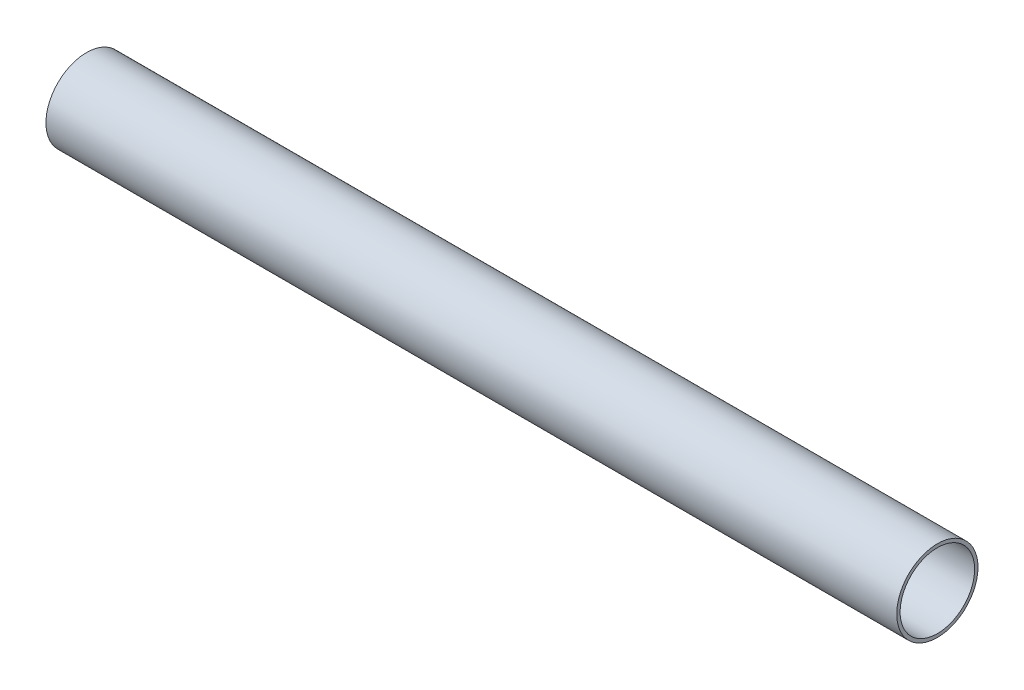
ISO-10303-21;
HEADER;
FILE_DESCRIPTION(('STEP AP214'),'2;1');
FILE_NAME('part.step','',(''),(''),'','','');
FILE_SCHEMA(('AUTOMOTIVE_DESIGN { 1 0 10303 214 1 1 1 1 }'));
ENDSEC;
DATA;
#1=APPLICATION_CONTEXT('core data for automotive mechanical design processes');
#2=APPLICATION_PROTOCOL_DEFINITION('international standard','automotive_design',2000,#1);
#3=PRODUCT_CONTEXT('',#1,'mechanical');
#4=PRODUCT('Part','Part','',(#3));
#5=PRODUCT_RELATED_PRODUCT_CATEGORY('part','',(#4));
#6=PRODUCT_DEFINITION_FORMATION('','',#4);
#7=PRODUCT_DEFINITION_CONTEXT('part definition',#1,'design');
#8=PRODUCT_DEFINITION('design','',#6,#7);
#9=PRODUCT_DEFINITION_SHAPE('','',#8);
#10=(LENGTH_UNIT() NAMED_UNIT(*) SI_UNIT(.MILLI.,.METRE.));
#11=(NAMED_UNIT(*) PLANE_ANGLE_UNIT() SI_UNIT($,.RADIAN.));
#12=(NAMED_UNIT(*) SI_UNIT($,.STERADIAN.) SOLID_ANGLE_UNIT());
#13=UNCERTAINTY_MEASURE_WITH_UNIT(LENGTH_MEASURE(1.E-05),#10,'distance_accuracy_value','');
#14=(GEOMETRIC_REPRESENTATION_CONTEXT(3) GLOBAL_UNCERTAINTY_ASSIGNED_CONTEXT((#13)) GLOBAL_UNIT_ASSIGNED_CONTEXT((#10,
#11,#12)) REPRESENTATION_CONTEXT('',''));
#15=CARTESIAN_POINT('',(0.,0.,0.));
#16=DIRECTION('',(0.,0.,1.));
#17=DIRECTION('',(1.,0.,0.));
#18=AXIS2_PLACEMENT_3D('',#15,#16,#17);
#19=CARTESIAN_POINT('',(398.8308,0.,0.));
#20=DIRECTION('',(1.,0.,0.));
#21=DIRECTION('',(0.,0.,-1.));
#22=AXIS2_PLACEMENT_3D('',#19,#20,#21);
#23=PLANE('',#22);
#24=CARTESIAN_POINT('',(398.8308,0.,0.));
#25=DIRECTION('',(1.,0.,0.));
#26=DIRECTION('',(0.,0.,-1.));
#27=AXIS2_PLACEMENT_3D('',#24,#25,#26);
#28=CIRCLE('',#27,19.05);
#29=CARTESIAN_POINT('',(398.8308,0.,-19.05));
#30=VERTEX_POINT('',#29);
#31=EDGE_CURVE('E10',#30,#30,#28,.T.);
#32=ORIENTED_EDGE('',*,*,#31,.T.);
#33=EDGE_LOOP('',(#32));
#34=FACE_BOUND('',#33,.T.);
#35=CARTESIAN_POINT('',(398.8308,0.,0.));
#36=DIRECTION('',(1.,0.,0.));
#37=DIRECTION('',(0.,0.,-1.));
#38=AXIS2_PLACEMENT_3D('',#35,#36,#37);
#39=CIRCLE('',#38,17.4625);
#40=CARTESIAN_POINT('',(398.8308,0.,-17.4625));
#41=VERTEX_POINT('',#40);
#42=EDGE_CURVE('E44',#41,#41,#39,.T.);
#43=ORIENTED_EDGE('',*,*,#42,.F.);
#44=EDGE_LOOP('',(#43));
#45=FACE_BOUND('',#44,.T.);
#46=ADVANCED_FACE('F33',(#34,#45),#23,.T.);
#47=CARTESIAN_POINT('',(0.,0.,0.));
#48=DIRECTION('',(1.,0.,0.));
#49=DIRECTION('',(0.,0.,-1.));
#50=AXIS2_PLACEMENT_3D('',#47,#48,#49);
#51=PLANE('',#50);
#52=CARTESIAN_POINT('',(0.,0.,0.));
#53=DIRECTION('',(1.,0.,0.));
#54=DIRECTION('',(0.,0.,-1.));
#55=AXIS2_PLACEMENT_3D('',#52,#53,#54);
#56=CIRCLE('',#55,19.05);
#57=CARTESIAN_POINT('',(0.,0.,-19.05));
#58=VERTEX_POINT('',#57);
#59=EDGE_CURVE('E37',#58,#58,#56,.T.);
#60=ORIENTED_EDGE('',*,*,#59,.F.);
#61=EDGE_LOOP('',(#60));
#62=FACE_BOUND('',#61,.T.);
#63=CARTESIAN_POINT('',(0.,0.,0.));
#64=DIRECTION('',(1.,0.,0.));
#65=DIRECTION('',(0.,0.,-1.));
#66=AXIS2_PLACEMENT_3D('',#63,#64,#65);
#67=CIRCLE('',#66,17.4625);
#68=CARTESIAN_POINT('',(0.,0.,-17.4625));
#69=VERTEX_POINT('',#68);
#70=EDGE_CURVE('E46',#69,#69,#67,.T.);
#71=ORIENTED_EDGE('',*,*,#70,.T.);
#72=EDGE_LOOP('',(#71));
#73=FACE_BOUND('',#72,.T.);
#74=ADVANCED_FACE('F56',(#62,#73),#51,.F.);
#75=CARTESIAN_POINT('',(398.8308,0.,0.));
#76=DIRECTION('',(-1.,0.,0.));
#77=DIRECTION('',(0.,0.,1.));
#78=AXIS2_PLACEMENT_3D('',#75,#76,#77);
#79=CYLINDRICAL_SURFACE('',#78,19.05);
#80=ORIENTED_EDGE('',*,*,#31,.F.);
#81=EDGE_LOOP('',(#80));
#82=FACE_BOUND('',#81,.T.);
#83=ORIENTED_EDGE('',*,*,#59,.T.);
#84=EDGE_LOOP('',(#83));
#85=FACE_BOUND('',#84,.T.);
#86=ADVANCED_FACE('F35',(#82,#85),#79,.T.);
#87=CARTESIAN_POINT('',(398.8308,0.,0.));
#88=DIRECTION('',(-1.,0.,0.));
#89=DIRECTION('',(0.,0.,1.));
#90=AXIS2_PLACEMENT_3D('',#87,#88,#89);
#91=CYLINDRICAL_SURFACE('',#90,17.4625);
#92=ORIENTED_EDGE('',*,*,#42,.T.);
#93=EDGE_LOOP('',(#92));
#94=FACE_BOUND('',#93,.T.);
#95=ORIENTED_EDGE('',*,*,#70,.F.);
#96=EDGE_LOOP('',(#95));
#97=FACE_BOUND('',#96,.T.);
#98=ADVANCED_FACE('F52',(#94,#97),#91,.F.);
#99=CLOSED_SHELL('',(#46,#74,#86,#98));
#100=MANIFOLD_SOLID_BREP('B2',#99);
#101=ADVANCED_BREP_SHAPE_REPRESENTATION('',(#18,#100),#14);
#102=SHAPE_DEFINITION_REPRESENTATION(#9,#101);
ENDSEC;
END-ISO-10303-21;
